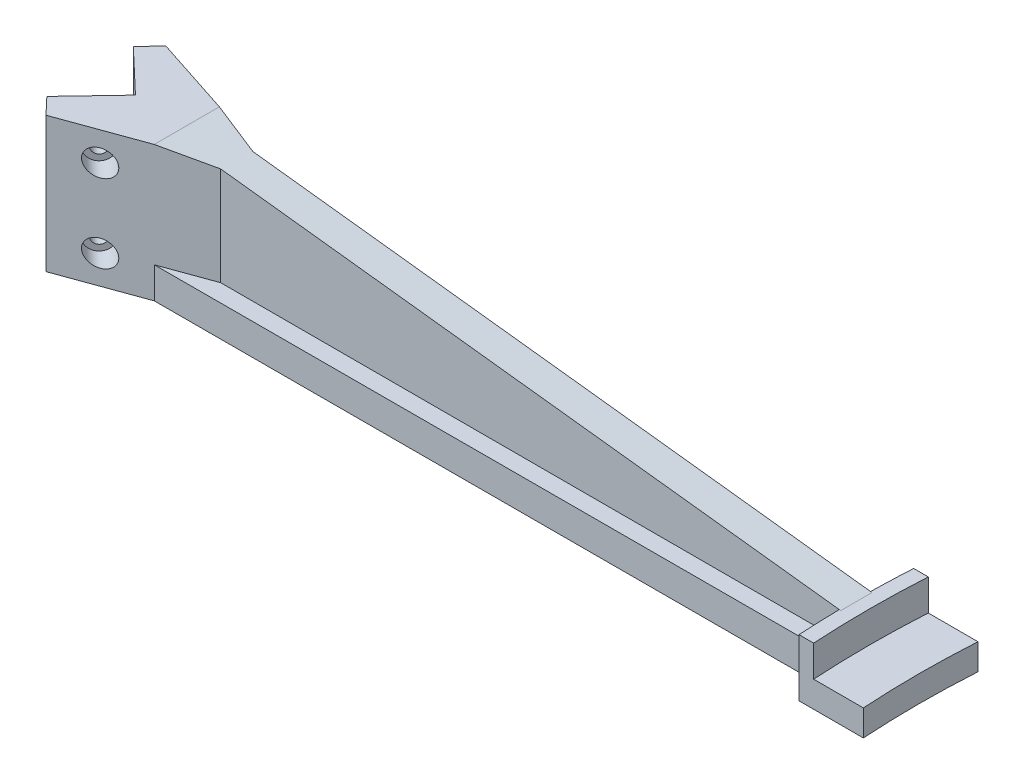
ISO-10303-21;
HEADER;
FILE_DESCRIPTION(('STEP AP214'),'2;1');
FILE_NAME('part.step','',(''),(''),'','','');
FILE_SCHEMA(('AUTOMOTIVE_DESIGN { 1 0 10303 214 1 1 1 1 }'));
ENDSEC;
DATA;
#1=APPLICATION_CONTEXT('core data for automotive mechanical design processes');
#2=APPLICATION_PROTOCOL_DEFINITION('international standard','automotive_design',2000,#1);
#3=PRODUCT_CONTEXT('',#1,'mechanical');
#4=PRODUCT('Part','Part','',(#3));
#5=PRODUCT_RELATED_PRODUCT_CATEGORY('part','',(#4));
#6=PRODUCT_DEFINITION_FORMATION('','',#4);
#7=PRODUCT_DEFINITION_CONTEXT('part definition',#1,'design');
#8=PRODUCT_DEFINITION('design','',#6,#7);
#9=PRODUCT_DEFINITION_SHAPE('','',#8);
#10=(LENGTH_UNIT() NAMED_UNIT(*) SI_UNIT(.MILLI.,.METRE.));
#11=(NAMED_UNIT(*) PLANE_ANGLE_UNIT() SI_UNIT($,.RADIAN.));
#12=(NAMED_UNIT(*) SI_UNIT($,.STERADIAN.) SOLID_ANGLE_UNIT());
#13=UNCERTAINTY_MEASURE_WITH_UNIT(LENGTH_MEASURE(1.E-05),#10,'distance_accuracy_value','');
#14=(GEOMETRIC_REPRESENTATION_CONTEXT(3) GLOBAL_UNCERTAINTY_ASSIGNED_CONTEXT((#13)) GLOBAL_UNIT_ASSIGNED_CONTEXT((#10,
#11,#12)) REPRESENTATION_CONTEXT('',''));
#15=CARTESIAN_POINT('',(0.,0.,0.));
#16=DIRECTION('',(0.,0.,1.));
#17=DIRECTION('',(1.,0.,0.));
#18=AXIS2_PLACEMENT_3D('',#15,#16,#17);
#19=CARTESIAN_POINT('',(-25.6803366585188,-12.,-70.7816506538621));
#20=DIRECTION('',(0.341057417786521,0.,0.940042465941188));
#21=DIRECTION('',(0.940042465941188,0.,-0.341057417786521));
#22=AXIS2_PLACEMENT_3D('',#19,#20,#21);
#23=PLANE('',#22);
#24=CARTESIAN_POINT('',(-271.261664320799,29.,18.3178703823747));
#25=DIRECTION('',(0.341057417786521,0.,0.940042465941188));
#26=DIRECTION('',(-0.940042465941188,0.,0.341057417786521));
#27=AXIS2_PLACEMENT_3D('',#24,#25,#26);
#28=ELLIPSE('',#27,5.58833937893238,4.99999999999999);
#29=CARTESIAN_POINT('',(-276.514940651087,29.,20.2238149806681));
#30=VERTEX_POINT('',#29);
#31=EDGE_CURVE('E191',#30,#30,#28,.T.);
#32=ORIENTED_EDGE('',*,*,#31,.F.);
#33=EDGE_LOOP('',(#32));
#34=FACE_BOUND('',#33,.T.);
#35=CARTESIAN_POINT('',(-271.261664320799,-0.999999999999997,18.3178703823747));
#36=DIRECTION('',(0.341057417786521,0.,0.940042465941188));
#37=DIRECTION('',(-0.940042465941188,0.,0.341057417786521));
#38=AXIS2_PLACEMENT_3D('',#35,#36,#37);
#39=ELLIPSE('',#38,5.58833937893238,4.99999999999999);
#40=CARTESIAN_POINT('',(-276.514940651087,-0.999999999999997,20.2238149806681));
#41=VERTEX_POINT('',#40);
#42=EDGE_CURVE('E322',#41,#41,#39,.T.);
#43=ORIENTED_EDGE('',*,*,#42,.F.);
#44=EDGE_LOOP('',(#43));
#45=FACE_BOUND('',#44,.T.);
#46=DIRECTION('',(0.,1.,0.));
#47=VECTOR('',#46,1.);
#48=CARTESIAN_POINT('',(-237.310427240128,-12.,6.00000000000001));
#49=LINE('',#48,#47);
#50=CARTESIAN_POINT('',(-237.310427240128,0.,6.));
#51=VERTEX_POINT('',#50);
#52=CARTESIAN_POINT('',(-237.310427240129,37.8127309338108,6.));
#53=VERTEX_POINT('',#52);
#54=EDGE_CURVE('E198',#51,#53,#49,.T.);
#55=ORIENTED_EDGE('',*,*,#54,.T.);
#56=DIRECTION('',(-0.934419482049458,0.109212980858722,0.339017339347673));
#57=VECTOR('',#56,1.);
#58=CARTESIAN_POINT('',(-23.1211234088442,12.77873625707,-71.7101604756234));
#59=LINE('',#58,#57);
#60=CARTESIAN_POINT('',(-256.02456554,40.,12.7896886746107));
#61=VERTEX_POINT('',#60);
#62=EDGE_CURVE('E185',#53,#61,#59,.T.);
#63=ORIENTED_EDGE('',*,*,#62,.T.);
#64=DIRECTION('',(0.940042465941188,0.,-0.341057417786521));
#65=VECTOR('',#64,1.);
#66=CARTESIAN_POINT('',(-25.6803366585188,40.,-70.7816506538621));
#67=LINE('',#66,#65);
#68=CARTESIAN_POINT('',(-286.510767905309,40.,23.8504075607723));
#69=VERTEX_POINT('',#68);
#70=EDGE_CURVE('E196',#69,#61,#67,.T.);
#71=ORIENTED_EDGE('',*,*,#70,.F.);
#72=DIRECTION('',(0.,1.,0.));
#73=VECTOR('',#72,1.);
#74=CARTESIAN_POINT('',(-286.510767905309,-12.,23.8504075607723));
#75=LINE('',#74,#73);
#76=CARTESIAN_POINT('',(-286.510767905309,-12.,23.8504075607723));
#77=VERTEX_POINT('',#76);
#78=EDGE_CURVE('E296',#77,#69,#75,.T.);
#79=ORIENTED_EDGE('',*,*,#78,.F.);
#80=DIRECTION('',(0.940042465941188,0.,-0.341057417786521));
#81=VECTOR('',#80,1.);
#82=CARTESIAN_POINT('',(-25.6803366585188,-12.,-70.7816506538621));
#83=LINE('',#82,#81);
#84=CARTESIAN_POINT('',(-256.02456554,-12.,12.7896886746107));
#85=VERTEX_POINT('',#84);
#86=EDGE_CURVE('E285',#77,#85,#83,.T.);
#87=ORIENTED_EDGE('',*,*,#86,.T.);
#88=DIRECTION('',(0.,1.,0.));
#89=VECTOR('',#88,1.);
#90=CARTESIAN_POINT('',(-256.02456554,-12.,12.7896886746107));
#91=LINE('',#90,#89);
#92=CARTESIAN_POINT('',(-256.02456554,0.,12.7896886746107));
#93=VERTEX_POINT('',#92);
#94=EDGE_CURVE('E293',#85,#93,#91,.T.);
#95=ORIENTED_EDGE('',*,*,#94,.T.);
#96=DIRECTION('',(0.940042465941188,0.,-0.341057417786521));
#97=VECTOR('',#96,1.);
#98=CARTESIAN_POINT('',(-25.6803366585188,0.,-70.7816506538621));
#99=LINE('',#98,#97);
#100=EDGE_CURVE('E211',#93,#51,#99,.T.);
#101=ORIENTED_EDGE('',*,*,#100,.T.);
#102=EDGE_LOOP('',(#55,#63,#71,#79,#87,#95,#101));
#103=FACE_BOUND('',#102,.T.);
#104=ADVANCED_FACE('F39',(#34,#45,#103),#23,.T.);
#105=CARTESIAN_POINT('',(-21.000464266402,-12.,64.4135522537525));
#106=DIRECTION('',(-0.309967834756297,0.,0.950747043864188));
#107=DIRECTION('',(0.950747043864188,0.,0.309967834756297));
#108=AXIS2_PLACEMENT_3D('',#105,#106,#107);
#109=PLANE('',#108);
#110=CARTESIAN_POINT('',(-272.154965736293,29.,-17.4692340376555));
#111=DIRECTION('',(-0.309967834756297,0.,0.950747043864188));
#112=DIRECTION('',(-0.950747043864188,0.,-0.309967834756297));
#113=AXIS2_PLACEMENT_3D('',#110,#111,#112);
#114=ELLIPSE('',#113,5.68470562785377,4.99999999999999);
#115=CARTESIAN_POINT('',(-277.559682807213,29.,-19.2313099323483));
#116=VERTEX_POINT('',#115);
#117=EDGE_CURVE('E332',#116,#116,#114,.F.);
#118=ORIENTED_EDGE('',*,*,#117,.F.);
#119=EDGE_LOOP('',(#118));
#120=FACE_BOUND('',#119,.T.);
#121=CARTESIAN_POINT('',(-272.154965736293,-0.999999999999997,-17.4692340376555));
#122=DIRECTION('',(-0.309967834756297,0.,0.950747043864188));
#123=DIRECTION('',(-0.950747043864188,0.,-0.309967834756297));
#124=AXIS2_PLACEMENT_3D('',#121,#122,#123);
#125=ELLIPSE('',#124,5.68470562785377,4.99999999999999);
#126=CARTESIAN_POINT('',(-277.559682807213,-0.999999999999997,-19.2313099323483));
#127=VERTEX_POINT('',#126);
#128=EDGE_CURVE('E337',#127,#127,#125,.F.);
#129=ORIENTED_EDGE('',*,*,#128,.F.);
#130=EDGE_LOOP('',(#129));
#131=FACE_BOUND('',#130,.T.);
#132=DIRECTION('',(-0.944930964694918,0.110441540809588,-0.308071644304268));
#133=VECTOR('',#132,1.);
#134=CARTESIAN_POINT('',(-18.4404308643584,12.2316667715908,65.2481885701696));
#135=LINE('',#134,#133);
#136=CARTESIAN_POINT('',(-236.976024136559,37.7736466034316,-6.));
#137=VERTEX_POINT('',#136);
#138=CARTESIAN_POINT('',(-256.02456554,40.,-12.2103113253893));
#139=VERTEX_POINT('',#138);
#140=EDGE_CURVE('E56',#137,#139,#135,.T.);
#141=ORIENTED_EDGE('',*,*,#140,.F.);
#142=DIRECTION('',(0.,-1.,0.));
#143=VECTOR('',#142,1.);
#144=CARTESIAN_POINT('',(-236.976024136559,-12.,-6.00000000000001));
#145=LINE('',#144,#143);
#146=CARTESIAN_POINT('',(-236.976024136559,0.,-6.));
#147=VERTEX_POINT('',#146);
#148=EDGE_CURVE('E214',#137,#147,#145,.T.);
#149=ORIENTED_EDGE('',*,*,#148,.T.);
#150=DIRECTION('',(0.950747043864188,0.,0.309967834756297));
#151=VECTOR('',#150,1.);
#152=CARTESIAN_POINT('',(-21.000464266402,0.,64.4135522537525));
#153=LINE('',#152,#151);
#154=CARTESIAN_POINT('',(-256.02456554,0.,-12.2103113253893));
#155=VERTEX_POINT('',#154);
#156=EDGE_CURVE('E206',#155,#147,#153,.T.);
#157=ORIENTED_EDGE('',*,*,#156,.F.);
#158=DIRECTION('',(0.,1.,0.));
#159=VECTOR('',#158,1.);
#160=CARTESIAN_POINT('',(-256.02456554,-12.,-12.2103113253893));
#161=LINE('',#160,#159);
#162=CARTESIAN_POINT('',(-256.02456554,-12.,-12.2103113253893));
#163=VERTEX_POINT('',#162);
#164=EDGE_CURVE('E306',#163,#155,#161,.T.);
#165=ORIENTED_EDGE('',*,*,#164,.F.);
#166=DIRECTION('',(0.950747043864188,0.,0.309967834756297));
#167=VECTOR('',#166,1.);
#168=CARTESIAN_POINT('',(-21.000464266402,-12.,64.4135522537525));
#169=LINE('',#168,#167);
#170=CARTESIAN_POINT('',(-286.510767905309,-12.,-22.1495924392277));
#171=VERTEX_POINT('',#170);
#172=EDGE_CURVE('E273',#171,#163,#169,.T.);
#173=ORIENTED_EDGE('',*,*,#172,.F.);
#174=DIRECTION('',(0.,1.,0.));
#175=VECTOR('',#174,1.);
#176=CARTESIAN_POINT('',(-286.510767905309,-12.,-22.1495924392277));
#177=LINE('',#176,#175);
#178=CARTESIAN_POINT('',(-286.510767905309,40.,-22.1495924392277));
#179=VERTEX_POINT('',#178);
#180=EDGE_CURVE('E304',#171,#179,#177,.T.);
#181=ORIENTED_EDGE('',*,*,#180,.T.);
#182=DIRECTION('',(0.950747043864188,0.,0.309967834756297));
#183=VECTOR('',#182,1.);
#184=CARTESIAN_POINT('',(-21.000464266402,40.,64.4135522537525));
#185=LINE('',#184,#183);
#186=EDGE_CURVE('E205',#179,#139,#185,.T.);
#187=ORIENTED_EDGE('',*,*,#186,.T.);
#188=EDGE_LOOP('',(#141,#149,#157,#165,#173,#181,#187));
#189=FACE_BOUND('',#188,.T.);
#190=ADVANCED_FACE('F394',(#120,#131,#189),#109,.F.);
#191=CARTESIAN_POINT('',(0.,40.,0.));
#192=DIRECTION('',(0.,1.,0.));
#193=DIRECTION('',(0.,0.,1.));
#194=AXIS2_PLACEMENT_3D('',#191,#192,#193);
#195=PLANE('',#194);
#196=ORIENTED_EDGE('',*,*,#70,.T.);
#197=DIRECTION('',(0.,0.,1.));
#198=VECTOR('',#197,1.);
#199=CARTESIAN_POINT('',(-256.02456554,40.,-22.1495924392277));
#200=LINE('',#199,#198);
#201=EDGE_CURVE('E181',#139,#61,#200,.T.);
#202=ORIENTED_EDGE('',*,*,#201,.F.);
#203=ORIENTED_EDGE('',*,*,#186,.F.);
#204=DIRECTION('',(0.688749461914691,0.,-0.724999433594415));
#205=VECTOR('',#204,1.);
#206=CARTESIAN_POINT('',(-161.657230340382,40.,-153.574368823362));
#207=LINE('',#206,#205);
#208=CARTESIAN_POINT('',(-292.596610314021,40.,-15.7434425353199));
#209=VERTEX_POINT('',#208);
#210=EDGE_CURVE('E208',#209,#179,#207,.T.);
#211=ORIENTED_EDGE('',*,*,#210,.F.);
#212=DIRECTION('',(-0.724999433594416,0.,-0.688749461914691));
#213=VECTOR('',#212,1.);
#214=CARTESIAN_POINT('',(-130.939379973639,40.,137.830926288042));
#215=LINE('',#214,#213);
#216=CARTESIAN_POINT('',(-276.02456554,40.,0.));
#217=VERTEX_POINT('',#216);
#218=EDGE_CURVE('E219',#217,#209,#215,.T.);
#219=ORIENTED_EDGE('',*,*,#218,.F.);
#220=DIRECTION('',(-0.688749461914691,0.,0.724999433594416));
#221=VECTOR('',#220,1.);
#222=CARTESIAN_POINT('',(-145.085185566361,40.,-137.830926288042));
#223=LINE('',#222,#221);
#224=CARTESIAN_POINT('',(-292.596610314021,40.,17.4442576568645));
#225=VERTEX_POINT('',#224);
#226=EDGE_CURVE('E222',#217,#225,#223,.T.);
#227=ORIENTED_EDGE('',*,*,#226,.T.);
#228=DIRECTION('',(0.688749461914691,0.,0.724999433594415));
#229=VECTOR('',#228,1.);
#230=CARTESIAN_POINT('',(-162.506520414215,40.,154.381194393503));
#231=LINE('',#230,#229);
#232=EDGE_CURVE('E204',#225,#69,#231,.T.);
#233=ORIENTED_EDGE('',*,*,#232,.T.);
#234=EDGE_LOOP('',(#196,#202,#203,#211,#219,#227,#233));
#235=FACE_BOUND('',#234,.T.);
#236=ADVANCED_FACE('F201',(#235),#195,.T.);
#237=CARTESIAN_POINT('',(0.,0.,0.));
#238=DIRECTION('',(0.,1.,0.));
#239=DIRECTION('',(0.,0.,1.));
#240=AXIS2_PLACEMENT_3D('',#237,#238,#239);
#241=PLANE('',#240);
#242=CARTESIAN_POINT('',(370.6,0.,0.));
#243=DIRECTION('',(0.,1.,0.));
#244=DIRECTION('',(0.,0.,1.));
#245=AXIS2_PLACEMENT_3D('',#242,#243,#244);
#246=CIRCLE('',#245,370.6);
#247=CARTESIAN_POINT('',(0.210866790074399,0.,12.5));
#248=VERTEX_POINT('',#247);
#249=CARTESIAN_POINT('',(0.0485730698099318,0.,6.));
#250=VERTEX_POINT('',#249);
#251=EDGE_CURVE('E11',#248,#250,#246,.F.);
#252=ORIENTED_EDGE('',*,*,#251,.T.);
#253=DIRECTION('',(1.,0.,0.));
#254=VECTOR('',#253,1.);
#255=CARTESIAN_POINT('',(-256.02456554,0.,6.));
#256=LINE('',#255,#254);
#257=EDGE_CURVE('E373',#51,#250,#256,.T.);
#258=ORIENTED_EDGE('',*,*,#257,.F.);
#259=ORIENTED_EDGE('',*,*,#100,.F.);
#260=DIRECTION('',(0.999999360921432,0.,-0.00113055593772735));
#261=VECTOR('',#260,1.);
#262=CARTESIAN_POINT('',(0.0141322097109725,0.,12.5002224195901));
#263=LINE('',#262,#261);
#264=EDGE_CURVE('E258',#93,#248,#263,.T.);
#265=ORIENTED_EDGE('',*,*,#264,.T.);
#266=EDGE_LOOP('',(#252,#258,#259,#265));
#267=FACE_BOUND('',#266,.T.);
#268=ADVANCED_FACE('F438',(#267),#241,.T.);
#269=CARTESIAN_POINT('',(370.6,-12.,0.));
#270=DIRECTION('',(0.,1.,0.));
#271=DIRECTION('',(0.,0.,1.));
#272=AXIS2_PLACEMENT_3D('',#269,#270,#271);
#273=CYLINDRICAL_SURFACE('',#272,370.6);
#274=CARTESIAN_POINT('',(370.6,10.,0.));
#275=DIRECTION('',(0.,1.,0.));
#276=DIRECTION('',(0.,0.,1.));
#277=AXIS2_PLACEMENT_3D('',#274,#275,#276);
#278=CIRCLE('',#277,370.6);
#279=CARTESIAN_POINT('',(0.0485730698099318,10.,6.));
#280=VERTEX_POINT('',#279);
#281=CARTESIAN_POINT('',(0.653571445810575,10.,21.9999999999998));
#282=VERTEX_POINT('',#281);
#283=EDGE_CURVE('E235',#280,#282,#278,.T.);
#284=ORIENTED_EDGE('',*,*,#283,.F.);
#285=DIRECTION('',(0.,1.,0.));
#286=VECTOR('',#285,1.);
#287=CARTESIAN_POINT('',(0.0485730698099318,-12.,6.));
#288=LINE('',#287,#286);
#289=EDGE_CURVE('E64',#280,#250,#288,.F.);
#290=ORIENTED_EDGE('',*,*,#289,.T.);
#291=ORIENTED_EDGE('',*,*,#251,.F.);
#292=DIRECTION('',(0.,1.,0.));
#293=VECTOR('',#292,1.);
#294=CARTESIAN_POINT('',(0.210866790074399,-12.,12.5));
#295=LINE('',#294,#293);
#296=CARTESIAN_POINT('',(0.210866790074399,-12.,12.5));
#297=VERTEX_POINT('',#296);
#298=EDGE_CURVE('E288',#297,#248,#295,.T.);
#299=ORIENTED_EDGE('',*,*,#298,.F.);
#300=CARTESIAN_POINT('',(370.6,-12.,0.));
#301=DIRECTION('',(0.,1.,0.));
#302=DIRECTION('',(0.,0.,1.));
#303=AXIS2_PLACEMENT_3D('',#300,#301,#302);
#304=CIRCLE('',#303,370.6);
#305=CARTESIAN_POINT('',(0.653571445810575,-12.,22.));
#306=VERTEX_POINT('',#305);
#307=EDGE_CURVE('E262',#297,#306,#304,.T.);
#308=ORIENTED_EDGE('',*,*,#307,.T.);
#309=DIRECTION('',(0.,1.,0.));
#310=VECTOR('',#309,1.);
#311=CARTESIAN_POINT('',(0.653571445810575,-12.,22.));
#312=LINE('',#311,#310);
#313=EDGE_CURVE('E318',#306,#282,#312,.T.);
#314=ORIENTED_EDGE('',*,*,#313,.T.);
#315=EDGE_LOOP('',(#284,#290,#291,#299,#308,#314));
#316=FACE_BOUND('',#315,.T.);
#317=ADVANCED_FACE('F442',(#316),#273,.T.);
#318=DIRECTION('',(1.,0.,0.));
#319=VECTOR('',#318,1.);
#320=CARTESIAN_POINT('',(-256.02456554,0.,-6.));
#321=LINE('',#320,#319);
#322=CARTESIAN_POINT('',(0.0485730698099318,0.,-6.));
#323=VERTEX_POINT('',#322);
#324=EDGE_CURVE('E377',#147,#323,#321,.T.);
#325=ORIENTED_EDGE('',*,*,#324,.T.);
#326=CARTESIAN_POINT('',(0.210866790074427,0.,-12.5));
#327=VERTEX_POINT('',#326);
#328=EDGE_CURVE('E48',#323,#327,#246,.F.);
#329=ORIENTED_EDGE('',*,*,#328,.T.);
#330=DIRECTION('',(0.999999360921432,0.,-0.00113055593772736));
#331=VECTOR('',#330,1.);
#332=CARTESIAN_POINT('',(-0.0141316706693596,0.,-12.4997456264917));
#333=LINE('',#332,#331);
#334=EDGE_CURVE('E263',#155,#327,#333,.T.);
#335=ORIENTED_EDGE('',*,*,#334,.F.);
#336=ORIENTED_EDGE('',*,*,#156,.T.);
#337=EDGE_LOOP('',(#325,#329,#335,#336));
#338=FACE_BOUND('',#337,.T.);
#339=ADVANCED_FACE('F399',(#338),#241,.T.);
#340=CARTESIAN_POINT('',(0.0141322097109725,-12.,12.5002224195901));
#341=DIRECTION('',(0.00113055593772735,0.,0.999999360921431));
#342=DIRECTION('',(0.999999360921432,0.,-0.00113055593772735));
#343=AXIS2_PLACEMENT_3D('',#340,#341,#342);
#344=PLANE('',#343);
#345=ORIENTED_EDGE('',*,*,#264,.F.);
#346=ORIENTED_EDGE('',*,*,#94,.F.);
#347=DIRECTION('',(0.999999360921432,0.,-0.00113055593772735));
#348=VECTOR('',#347,1.);
#349=CARTESIAN_POINT('',(0.0141322097109725,-12.,12.5002224195901));
#350=LINE('',#349,#348);
#351=EDGE_CURVE('E259',#85,#297,#350,.T.);
#352=ORIENTED_EDGE('',*,*,#351,.T.);
#353=ORIENTED_EDGE('',*,*,#298,.T.);
#354=EDGE_LOOP('',(#345,#346,#352,#353));
#355=FACE_BOUND('',#354,.T.);
#356=ADVANCED_FACE('F41',(#355),#344,.T.);
#357=CARTESIAN_POINT('',(-162.506520414215,-12.,154.381194393503));
#358=DIRECTION('',(-0.724999433594415,0.,0.688749461914691));
#359=DIRECTION('',(0.688749461914691,0.,0.724999433594415));
#360=AXIS2_PLACEMENT_3D('',#357,#358,#359);
#361=PLANE('',#360);
#362=ORIENTED_EDGE('',*,*,#78,.T.);
#363=ORIENTED_EDGE('',*,*,#232,.F.);
#364=DIRECTION('',(0.,1.,0.));
#365=VECTOR('',#364,1.);
#366=CARTESIAN_POINT('',(-292.596610314021,-12.,17.4442576568645));
#367=LINE('',#366,#365);
#368=CARTESIAN_POINT('',(-292.596610314021,-12.,17.4442576568645));
#369=VERTEX_POINT('',#368);
#370=EDGE_CURVE('E298',#369,#225,#367,.T.);
#371=ORIENTED_EDGE('',*,*,#370,.F.);
#372=DIRECTION('',(0.688749461914691,0.,0.724999433594415));
#373=VECTOR('',#372,1.);
#374=CARTESIAN_POINT('',(-162.506520414215,-12.,154.381194393503));
#375=LINE('',#374,#373);
#376=EDGE_CURVE('E282',#369,#77,#375,.T.);
#377=ORIENTED_EDGE('',*,*,#376,.T.);
#378=EDGE_LOOP('',(#362,#363,#371,#377));
#379=FACE_BOUND('',#378,.T.);
#380=ADVANCED_FACE('F428',(#379),#361,.T.);
#381=CARTESIAN_POINT('',(-145.085185566361,-12.,-137.830926288042));
#382=DIRECTION('',(-0.724999433594416,0.,-0.688749461914691));
#383=DIRECTION('',(-0.688749461914691,0.,0.724999433594416));
#384=AXIS2_PLACEMENT_3D('',#381,#382,#383);
#385=PLANE('',#384);
#386=CARTESIAN_POINT('',(-282.912060159147,29.,7.24999433594414));
#387=DIRECTION('',(-0.724999433594416,0.,-0.688749461914691));
#388=DIRECTION('',(-0.688749461914691,0.,0.724999433594416));
#389=AXIS2_PLACEMENT_3D('',#386,#387,#388);
#390=CIRCLE('',#389,2.75000000000005);
#391=CARTESIAN_POINT('',(-284.806121179412,29.,9.24374277832882));
#392=VERTEX_POINT('',#391);
#393=EDGE_CURVE('E331',#392,#392,#390,.T.);
#394=ORIENTED_EDGE('',*,*,#393,.F.);
#395=EDGE_LOOP('',(#394));
#396=FACE_BOUND('',#395,.T.);
#397=CARTESIAN_POINT('',(-282.912060159147,-0.999999999999997,7.24999433594414));
#398=DIRECTION('',(-0.724999433594416,0.,-0.688749461914691));
#399=DIRECTION('',(-0.688749461914691,0.,0.724999433594416));
#400=AXIS2_PLACEMENT_3D('',#397,#398,#399);
#401=CIRCLE('',#400,2.75000000000004);
#402=CARTESIAN_POINT('',(-284.806121179412,-0.999999999999997,9.24374277832882));
#403=VERTEX_POINT('',#402);
#404=EDGE_CURVE('E336',#403,#403,#401,.T.);
#405=ORIENTED_EDGE('',*,*,#404,.F.);
#406=EDGE_LOOP('',(#405));
#407=FACE_BOUND('',#406,.T.);
#408=ORIENTED_EDGE('',*,*,#370,.T.);
#409=ORIENTED_EDGE('',*,*,#226,.F.);
#410=DIRECTION('',(0.,1.,0.));
#411=VECTOR('',#410,1.);
#412=CARTESIAN_POINT('',(-276.02456554,-12.,0.));
#413=LINE('',#412,#411);
#414=CARTESIAN_POINT('',(-276.02456554,-12.,0.));
#415=VERTEX_POINT('',#414);
#416=EDGE_CURVE('E300',#415,#217,#413,.T.);
#417=ORIENTED_EDGE('',*,*,#416,.F.);
#418=DIRECTION('',(-0.688749461914691,0.,0.724999433594416));
#419=VECTOR('',#418,1.);
#420=CARTESIAN_POINT('',(-145.085185566361,-12.,-137.830926288042));
#421=LINE('',#420,#419);
#422=EDGE_CURVE('E279',#415,#369,#421,.T.);
#423=ORIENTED_EDGE('',*,*,#422,.T.);
#424=EDGE_LOOP('',(#408,#409,#417,#423));
#425=FACE_BOUND('',#424,.T.);
#426=ADVANCED_FACE('F491',(#396,#407,#425),#385,.T.);
#427=CARTESIAN_POINT('',(-130.939379973639,-12.,137.830926288042));
#428=DIRECTION('',(0.688749461914691,0.,-0.724999433594416));
#429=DIRECTION('',(-0.724999433594416,0.,-0.688749461914691));
#430=AXIS2_PLACEMENT_3D('',#427,#428,#429);
#431=PLANE('',#430);
#432=CARTESIAN_POINT('',(-283.284099342176,29.,-6.89655711206674));
#433=DIRECTION('',(0.688749461914691,0.,-0.724999433594416));
#434=DIRECTION('',(-0.724999433594416,0.,-0.688749461914691));
#435=AXIS2_PLACEMENT_3D('',#432,#433,#434);
#436=ELLIPSE('',#435,2.75361842105268,2.75000000000005);
#437=CARTESIAN_POINT('',(-285.280471137774,29.,-8.79311031788516));
#438=VERTEX_POINT('',#437);
#439=EDGE_CURVE('E344',#438,#438,#436,.F.);
#440=ORIENTED_EDGE('',*,*,#439,.F.);
#441=EDGE_LOOP('',(#440));
#442=FACE_BOUND('',#441,.T.);
#443=CARTESIAN_POINT('',(-283.284099342176,-0.999999999999997,-6.89655711206674));
#444=DIRECTION('',(0.688749461914691,0.,-0.724999433594416));
#445=DIRECTION('',(-0.724999433594416,0.,-0.688749461914691));
#446=AXIS2_PLACEMENT_3D('',#443,#444,#445);
#447=ELLIPSE('',#446,2.75361842105268,2.75000000000004);
#448=CARTESIAN_POINT('',(-285.280471137774,-0.999999999999997,-8.79311031788516));
#449=VERTEX_POINT('',#448);
#450=EDGE_CURVE('E352',#449,#449,#447,.F.);
#451=ORIENTED_EDGE('',*,*,#450,.F.);
#452=EDGE_LOOP('',(#451));
#453=FACE_BOUND('',#452,.T.);
#454=ORIENTED_EDGE('',*,*,#416,.T.);
#455=ORIENTED_EDGE('',*,*,#218,.T.);
#456=DIRECTION('',(0.,1.,0.));
#457=VECTOR('',#456,1.);
#458=CARTESIAN_POINT('',(-292.596610314021,-12.,-15.7434425353199));
#459=LINE('',#458,#457);
#460=CARTESIAN_POINT('',(-292.596610314021,-12.,-15.7434425353199));
#461=VERTEX_POINT('',#460);
#462=EDGE_CURVE('E302',#461,#209,#459,.T.);
#463=ORIENTED_EDGE('',*,*,#462,.F.);
#464=DIRECTION('',(-0.724999433594416,0.,-0.688749461914691));
#465=VECTOR('',#464,1.);
#466=CARTESIAN_POINT('',(-130.939379973639,-12.,137.830926288042));
#467=LINE('',#466,#465);
#468=EDGE_CURVE('E277',#415,#461,#467,.T.);
#469=ORIENTED_EDGE('',*,*,#468,.F.);
#470=EDGE_LOOP('',(#454,#455,#463,#469));
#471=FACE_BOUND('',#470,.T.);
#472=ADVANCED_FACE('F423',(#442,#453,#471),#431,.F.);
#473=CARTESIAN_POINT('',(-161.657230340382,-12.,-153.574368823362));
#474=DIRECTION('',(0.724999433594415,0.,0.688749461914691));
#475=DIRECTION('',(0.688749461914691,0.,-0.724999433594415));
#476=AXIS2_PLACEMENT_3D('',#473,#474,#475);
#477=PLANE('',#476);
#478=ORIENTED_EDGE('',*,*,#462,.T.);
#479=ORIENTED_EDGE('',*,*,#210,.T.);
#480=ORIENTED_EDGE('',*,*,#180,.F.);
#481=DIRECTION('',(0.688749461914691,0.,-0.724999433594415));
#482=VECTOR('',#481,1.);
#483=CARTESIAN_POINT('',(-161.657230340382,-12.,-153.574368823362));
#484=LINE('',#483,#482);
#485=EDGE_CURVE('E275',#461,#171,#484,.T.);
#486=ORIENTED_EDGE('',*,*,#485,.F.);
#487=EDGE_LOOP('',(#478,#479,#480,#486));
#488=FACE_BOUND('',#487,.T.);
#489=ADVANCED_FACE('F419',(#488),#477,.F.);
#490=CARTESIAN_POINT('',(-0.0141316706693596,-12.,-12.4997456264917));
#491=DIRECTION('',(0.00113055593772736,0.,0.999999360921431));
#492=DIRECTION('',(0.999999360921432,0.,-0.00113055593772736));
#493=AXIS2_PLACEMENT_3D('',#490,#491,#492);
#494=PLANE('',#493);
#495=ORIENTED_EDGE('',*,*,#334,.T.);
#496=DIRECTION('',(0.,1.,0.));
#497=VECTOR('',#496,1.);
#498=CARTESIAN_POINT('',(0.210866790074399,-12.,-12.5));
#499=LINE('',#498,#497);
#500=CARTESIAN_POINT('',(0.210866790074399,-12.,-12.5));
#501=VERTEX_POINT('',#500);
#502=EDGE_CURVE('E309',#501,#327,#499,.T.);
#503=ORIENTED_EDGE('',*,*,#502,.F.);
#504=DIRECTION('',(0.999999360921432,0.,-0.00113055593772736));
#505=VECTOR('',#504,1.);
#506=CARTESIAN_POINT('',(-0.0141316706693596,-12.,-12.4997456264917));
#507=LINE('',#506,#505);
#508=EDGE_CURVE('E271',#163,#501,#507,.T.);
#509=ORIENTED_EDGE('',*,*,#508,.F.);
#510=ORIENTED_EDGE('',*,*,#164,.T.);
#511=EDGE_LOOP('',(#495,#503,#509,#510));
#512=FACE_BOUND('',#511,.T.);
#513=ADVANCED_FACE('F403',(#512),#494,.F.);
#514=DIRECTION('',(0.,1.,0.));
#515=VECTOR('',#514,1.);
#516=CARTESIAN_POINT('',(0.0485730698099318,-12.,-6.));
#517=LINE('',#516,#515);
#518=CARTESIAN_POINT('',(0.0485730698099318,10.,-6.));
#519=VERTEX_POINT('',#518);
#520=EDGE_CURVE('E388',#519,#323,#517,.F.);
#521=ORIENTED_EDGE('',*,*,#520,.F.);
#522=CARTESIAN_POINT('',(0.653571445810575,10.,-22.));
#523=VERTEX_POINT('',#522);
#524=EDGE_CURVE('E236',#523,#519,#278,.T.);
#525=ORIENTED_EDGE('',*,*,#524,.F.);
#526=DIRECTION('',(0.,1.,0.));
#527=VECTOR('',#526,1.);
#528=CARTESIAN_POINT('',(0.653571445810575,-12.,-22.));
#529=LINE('',#528,#527);
#530=CARTESIAN_POINT('',(0.653571445810575,-12.,-22.));
#531=VERTEX_POINT('',#530);
#532=EDGE_CURVE('E312',#531,#523,#529,.T.);
#533=ORIENTED_EDGE('',*,*,#532,.F.);
#534=EDGE_CURVE('E267',#531,#501,#304,.T.);
#535=ORIENTED_EDGE('',*,*,#534,.T.);
#536=ORIENTED_EDGE('',*,*,#502,.T.);
#537=ORIENTED_EDGE('',*,*,#328,.F.);
#538=EDGE_LOOP('',(#521,#525,#533,#535,#536,#537));
#539=FACE_BOUND('',#538,.T.);
#540=ADVANCED_FACE('F407',(#539),#273,.T.);
#541=CARTESIAN_POINT('',(0.,-12.,-22.));
#542=DIRECTION('',(0.,0.,1.));
#543=DIRECTION('',(1.,0.,0.));
#544=AXIS2_PLACEMENT_3D('',#541,#542,#543);
#545=PLANE('',#544);
#546=DIRECTION('',(0.,-1.,0.));
#547=VECTOR('',#546,1.);
#548=CARTESIAN_POINT('',(25.3402114349254,-2.,-22.));
#549=LINE('',#548,#547);
#550=CARTESIAN_POINT('',(25.3402114349254,-2.,-22.));
#551=VERTEX_POINT('',#550);
#552=CARTESIAN_POINT('',(25.3402114349254,-12.,-22.));
#553=VERTEX_POINT('',#552);
#554=EDGE_CURVE('E250',#551,#553,#549,.T.);
#555=ORIENTED_EDGE('',*,*,#554,.T.);
#556=DIRECTION('',(1.,0.,0.));
#557=VECTOR('',#556,1.);
#558=CARTESIAN_POINT('',(0.,-12.,-22.));
#559=LINE('',#558,#557);
#560=EDGE_CURVE('E269',#531,#553,#559,.T.);
#561=ORIENTED_EDGE('',*,*,#560,.F.);
#562=ORIENTED_EDGE('',*,*,#532,.T.);
#563=DIRECTION('',(1.,0.,0.));
#564=VECTOR('',#563,1.);
#565=CARTESIAN_POINT('',(0.,10.,-22.));
#566=LINE('',#565,#564);
#567=CARTESIAN_POINT('',(6.26361696915306,10.,-22.));
#568=VERTEX_POINT('',#567);
#569=EDGE_CURVE('E232',#523,#568,#566,.T.);
#570=ORIENTED_EDGE('',*,*,#569,.T.);
#571=DIRECTION('',(0.,1.,0.));
#572=VECTOR('',#571,1.);
#573=CARTESIAN_POINT('',(6.26361696915312,-12.,-22.));
#574=LINE('',#573,#572);
#575=CARTESIAN_POINT('',(6.26361696915306,-2.,-22.));
#576=VERTEX_POINT('',#575);
#577=EDGE_CURVE('E314',#576,#568,#574,.T.);
#578=ORIENTED_EDGE('',*,*,#577,.F.);
#579=DIRECTION('',(1.,0.,0.));
#580=VECTOR('',#579,1.);
#581=CARTESIAN_POINT('',(0.,-2.,-22.));
#582=LINE('',#581,#580);
#583=EDGE_CURVE('E245',#576,#551,#582,.T.);
#584=ORIENTED_EDGE('',*,*,#583,.T.);
#585=EDGE_LOOP('',(#555,#561,#562,#570,#578,#584));
#586=FACE_BOUND('',#585,.T.);
#587=ADVANCED_FACE('F453',(#586),#545,.F.);
#588=CARTESIAN_POINT('',(370.6,-12.,0.));
#589=DIRECTION('',(0.,1.,0.));
#590=DIRECTION('',(0.,0.,1.));
#591=AXIS2_PLACEMENT_3D('',#588,#589,#590);
#592=CYLINDRICAL_SURFACE('',#591,365.);
#593=DIRECTION('',(0.,1.,0.));
#594=VECTOR('',#593,1.);
#595=CARTESIAN_POINT('',(6.26361696915312,-12.,22.));
#596=LINE('',#595,#594);
#597=CARTESIAN_POINT('',(6.26361696915306,-2.,21.9999999999999));
#598=VERTEX_POINT('',#597);
#599=CARTESIAN_POINT('',(6.26361696915306,10.,21.9999999999999));
#600=VERTEX_POINT('',#599);
#601=EDGE_CURVE('E316',#598,#600,#596,.T.);
#602=ORIENTED_EDGE('',*,*,#601,.F.);
#603=CARTESIAN_POINT('',(370.6,-2.,0.));
#604=DIRECTION('',(0.,1.,0.));
#605=DIRECTION('',(0.,0.,1.));
#606=AXIS2_PLACEMENT_3D('',#603,#604,#605);
#607=CIRCLE('',#606,365.);
#608=EDGE_CURVE('E248',#576,#598,#607,.T.);
#609=ORIENTED_EDGE('',*,*,#608,.F.);
#610=ORIENTED_EDGE('',*,*,#577,.T.);
#611=CARTESIAN_POINT('',(370.6,10.,0.));
#612=DIRECTION('',(0.,1.,0.));
#613=DIRECTION('',(0.,0.,1.));
#614=AXIS2_PLACEMENT_3D('',#611,#612,#613);
#615=CIRCLE('',#614,365.);
#616=EDGE_CURVE('E229',#568,#600,#615,.T.);
#617=ORIENTED_EDGE('',*,*,#616,.T.);
#618=EDGE_LOOP('',(#602,#609,#610,#617));
#619=FACE_BOUND('',#618,.T.);
#620=ADVANCED_FACE('F465',(#619),#592,.F.);
#621=CARTESIAN_POINT('',(0.,-12.,22.));
#622=DIRECTION('',(0.,0.,1.));
#623=DIRECTION('',(1.,0.,0.));
#624=AXIS2_PLACEMENT_3D('',#621,#622,#623);
#625=PLANE('',#624);
#626=DIRECTION('',(1.,0.,0.));
#627=VECTOR('',#626,1.);
#628=CARTESIAN_POINT('',(0.,-2.,22.));
#629=LINE('',#628,#627);
#630=CARTESIAN_POINT('',(25.3402114349254,-2.,21.9999999999998));
#631=VERTEX_POINT('',#630);
#632=EDGE_CURVE('E240',#598,#631,#629,.T.);
#633=ORIENTED_EDGE('',*,*,#632,.F.);
#634=ORIENTED_EDGE('',*,*,#601,.T.);
#635=DIRECTION('',(1.,0.,0.));
#636=VECTOR('',#635,1.);
#637=CARTESIAN_POINT('',(0.,10.,22.));
#638=LINE('',#637,#636);
#639=EDGE_CURVE('E225',#282,#600,#638,.T.);
#640=ORIENTED_EDGE('',*,*,#639,.F.);
#641=ORIENTED_EDGE('',*,*,#313,.F.);
#642=DIRECTION('',(1.,0.,0.));
#643=VECTOR('',#642,1.);
#644=CARTESIAN_POINT('',(0.,-12.,22.));
#645=LINE('',#644,#643);
#646=CARTESIAN_POINT('',(25.3402114349254,-12.,21.9999999999998));
#647=VERTEX_POINT('',#646);
#648=EDGE_CURVE('E266',#306,#647,#645,.T.);
#649=ORIENTED_EDGE('',*,*,#648,.T.);
#650=DIRECTION('',(0.,-1.,0.));
#651=VECTOR('',#650,1.);
#652=CARTESIAN_POINT('',(25.3402114349254,-2.,21.9999999999998));
#653=LINE('',#652,#651);
#654=EDGE_CURVE('E255',#631,#647,#653,.T.);
#655=ORIENTED_EDGE('',*,*,#654,.F.);
#656=EDGE_LOOP('',(#633,#634,#640,#641,#649,#655));
#657=FACE_BOUND('',#656,.T.);
#658=ADVANCED_FACE('F461',(#657),#625,.T.);
#659=CARTESIAN_POINT('',(0.,-12.,0.));
#660=DIRECTION('',(0.,1.,0.));
#661=DIRECTION('',(0.,0.,1.));
#662=AXIS2_PLACEMENT_3D('',#659,#660,#661);
#663=PLANE('',#662);
#664=CARTESIAN_POINT('',(370.6,-12.,0.));
#665=DIRECTION('',(0.,1.,0.));
#666=DIRECTION('',(0.,0.,1.));
#667=AXIS2_PLACEMENT_3D('',#664,#665,#666);
#668=CIRCLE('',#667,345.96);
#669=EDGE_CURVE('E239',#553,#647,#668,.T.);
#670=ORIENTED_EDGE('',*,*,#669,.T.);
#671=ORIENTED_EDGE('',*,*,#648,.F.);
#672=ORIENTED_EDGE('',*,*,#307,.F.);
#673=ORIENTED_EDGE('',*,*,#351,.F.);
#674=ORIENTED_EDGE('',*,*,#86,.F.);
#675=ORIENTED_EDGE('',*,*,#376,.F.);
#676=ORIENTED_EDGE('',*,*,#422,.F.);
#677=ORIENTED_EDGE('',*,*,#468,.T.);
#678=ORIENTED_EDGE('',*,*,#485,.T.);
#679=ORIENTED_EDGE('',*,*,#172,.T.);
#680=ORIENTED_EDGE('',*,*,#508,.T.);
#681=ORIENTED_EDGE('',*,*,#534,.F.);
#682=ORIENTED_EDGE('',*,*,#560,.T.);
#683=EDGE_LOOP('',(#670,#671,#672,#673,#674,#675,#676,#677,#678,#679,#680,#681,#682));
#684=FACE_BOUND('',#683,.T.);
#685=ADVANCED_FACE('F412',(#684),#663,.F.);
#686=CARTESIAN_POINT('',(370.6,-2.,0.));
#687=DIRECTION('',(0.,-1.,0.));
#688=DIRECTION('',(0.,0.,-1.));
#689=AXIS2_PLACEMENT_3D('',#686,#687,#688);
#690=CYLINDRICAL_SURFACE('',#689,345.96);
#691=ORIENTED_EDGE('',*,*,#669,.F.);
#692=ORIENTED_EDGE('',*,*,#554,.F.);
#693=CARTESIAN_POINT('',(370.6,-2.,0.));
#694=DIRECTION('',(0.,1.,0.));
#695=DIRECTION('',(0.,0.,1.));
#696=AXIS2_PLACEMENT_3D('',#693,#694,#695);
#697=CIRCLE('',#696,345.96);
#698=EDGE_CURVE('E242',#551,#631,#697,.T.);
#699=ORIENTED_EDGE('',*,*,#698,.T.);
#700=ORIENTED_EDGE('',*,*,#654,.T.);
#701=EDGE_LOOP('',(#691,#692,#699,#700));
#702=FACE_BOUND('',#701,.T.);
#703=ADVANCED_FACE('F457',(#702),#690,.F.);
#704=CARTESIAN_POINT('',(370.6,-2.,0.));
#705=DIRECTION('',(0.,1.,0.));
#706=DIRECTION('',(0.,0.,1.));
#707=AXIS2_PLACEMENT_3D('',#704,#705,#706);
#708=PLANE('',#707);
#709=ORIENTED_EDGE('',*,*,#632,.T.);
#710=ORIENTED_EDGE('',*,*,#698,.F.);
#711=ORIENTED_EDGE('',*,*,#583,.F.);
#712=ORIENTED_EDGE('',*,*,#608,.T.);
#713=EDGE_LOOP('',(#709,#710,#711,#712));
#714=FACE_BOUND('',#713,.T.);
#715=ADVANCED_FACE('F467',(#714),#708,.T.);
#716=CARTESIAN_POINT('',(370.6,10.,0.));
#717=DIRECTION('',(0.,1.,0.));
#718=DIRECTION('',(0.,0.,1.));
#719=AXIS2_PLACEMENT_3D('',#716,#717,#718);
#720=PLANE('',#719);
#721=DIRECTION('',(0.,0.,1.));
#722=VECTOR('',#721,1.);
#723=CARTESIAN_POINT('',(0.653571445810575,10.,-6.));
#724=LINE('',#723,#722);
#725=CARTESIAN_POINT('',(0.653571445810575,10.,-6.));
#726=VERTEX_POINT('',#725);
#727=CARTESIAN_POINT('',(0.653571445810575,10.,6.));
#728=VERTEX_POINT('',#727);
#729=EDGE_CURVE('E380',#726,#728,#724,.T.);
#730=ORIENTED_EDGE('',*,*,#729,.T.);
#731=DIRECTION('',(-1.,0.,0.));
#732=VECTOR('',#731,1.);
#733=CARTESIAN_POINT('',(370.6,10.,6.));
#734=LINE('',#733,#732);
#735=EDGE_CURVE('E383',#728,#280,#734,.T.);
#736=ORIENTED_EDGE('',*,*,#735,.T.);
#737=ORIENTED_EDGE('',*,*,#283,.T.);
#738=ORIENTED_EDGE('',*,*,#639,.T.);
#739=ORIENTED_EDGE('',*,*,#616,.F.);
#740=ORIENTED_EDGE('',*,*,#569,.F.);
#741=ORIENTED_EDGE('',*,*,#524,.T.);
#742=DIRECTION('',(-1.,0.,0.));
#743=VECTOR('',#742,1.);
#744=CARTESIAN_POINT('',(370.6,10.,-6.));
#745=LINE('',#744,#743);
#746=EDGE_CURVE('E387',#726,#519,#745,.T.);
#747=ORIENTED_EDGE('',*,*,#746,.F.);
#748=EDGE_LOOP('',(#730,#736,#737,#738,#739,#740,#741,#747));
#749=FACE_BOUND('',#748,.T.);
#750=ADVANCED_FACE('F445',(#749),#720,.T.);
#751=CARTESIAN_POINT('',(0.,0.,-6.));
#752=DIRECTION('',(0.,0.,-1.));
#753=DIRECTION('',(-1.,0.,0.));
#754=AXIS2_PLACEMENT_3D('',#751,#752,#753);
#755=PLANE('',#754);
#756=ORIENTED_EDGE('',*,*,#148,.F.);
#757=DIRECTION('',(-0.993238969664045,0.116087678677396,0.));
#758=VECTOR('',#757,1.);
#759=CARTESIAN_POINT('',(0.653571445810575,10.,-6.));
#760=LINE('',#759,#758);
#761=EDGE_CURVE('E375',#726,#137,#760,.T.);
#762=ORIENTED_EDGE('',*,*,#761,.F.);
#763=ORIENTED_EDGE('',*,*,#746,.T.);
#764=ORIENTED_EDGE('',*,*,#520,.T.);
#765=ORIENTED_EDGE('',*,*,#324,.F.);
#766=EDGE_LOOP('',(#756,#762,#763,#764,#765));
#767=FACE_BOUND('',#766,.T.);
#768=ADVANCED_FACE('F449',(#767),#755,.T.);
#769=CARTESIAN_POINT('',(0.653571445810575,10.,-6.));
#770=DIRECTION('',(0.116087678677396,0.993238969664045,0.));
#771=DIRECTION('',(-0.993238969664045,0.116087678677396,0.));
#772=AXIS2_PLACEMENT_3D('',#769,#770,#771);
#773=PLANE('',#772);
#774=ORIENTED_EDGE('',*,*,#62,.F.);
#775=DIRECTION('',(-0.993238969664045,0.116087678677396,0.));
#776=VECTOR('',#775,1.);
#777=CARTESIAN_POINT('',(0.653571445810575,10.,6.));
#778=LINE('',#777,#776);
#779=EDGE_CURVE('E371',#728,#53,#778,.T.);
#780=ORIENTED_EDGE('',*,*,#779,.F.);
#781=ORIENTED_EDGE('',*,*,#729,.F.);
#782=ORIENTED_EDGE('',*,*,#761,.T.);
#783=ORIENTED_EDGE('',*,*,#140,.T.);
#784=ORIENTED_EDGE('',*,*,#201,.T.);
#785=EDGE_LOOP('',(#774,#780,#781,#782,#783,#784));
#786=FACE_BOUND('',#785,.T.);
#787=ADVANCED_FACE('F183',(#786),#773,.T.);
#788=CARTESIAN_POINT('',(0.,0.,6.));
#789=DIRECTION('',(0.,0.,-1.));
#790=DIRECTION('',(-1.,0.,0.));
#791=AXIS2_PLACEMENT_3D('',#788,#789,#790);
#792=PLANE('',#791);
#793=ORIENTED_EDGE('',*,*,#54,.F.);
#794=ORIENTED_EDGE('',*,*,#257,.T.);
#795=ORIENTED_EDGE('',*,*,#289,.F.);
#796=ORIENTED_EDGE('',*,*,#735,.F.);
#797=ORIENTED_EDGE('',*,*,#779,.T.);
#798=EDGE_LOOP('',(#793,#794,#795,#796,#797));
#799=FACE_BOUND('',#798,.T.);
#800=ADVANCED_FACE('F448',(#799),#792,.F.);
#801=CARTESIAN_POINT('',(-112.597913427131,-0.999999999999997,169.048433731359));
#802=DIRECTION('',(-0.724999433594416,0.,-0.688749461914691));
#803=DIRECTION('',(-0.688749461914691,0.,0.724999433594416));
#804=AXIS2_PLACEMENT_3D('',#801,#802,#803);
#805=CYLINDRICAL_SURFACE('',#804,4.99999999999999);
#806=ORIENTED_EDGE('',*,*,#42,.T.);
#807=EDGE_LOOP('',(#806));
#808=FACE_BOUND('',#807,.T.);
#809=CARTESIAN_POINT('',(-277.112064690391,-0.999999999999997,12.7599900312617));
#810=DIRECTION('',(-0.724999433594416,0.,-0.688749461914691));
#811=DIRECTION('',(-0.688749461914691,0.,0.724999433594416));
#812=AXIS2_PLACEMENT_3D('',#809,#810,#811);
#813=CIRCLE('',#812,4.99999999999999);
#814=CARTESIAN_POINT('',(-280.555811999965,-0.999999999999997,16.3849871992338));
#815=VERTEX_POINT('',#814);
#816=EDGE_CURVE('E365',#815,#815,#813,.T.);
#817=ORIENTED_EDGE('',*,*,#816,.T.);
#818=EDGE_LOOP('',(#817));
#819=FACE_BOUND('',#818,.T.);
#820=ADVANCED_FACE('F691',(#808,#819),#805,.F.);
#821=CARTESIAN_POINT('',(-277.112064690391,-0.999999999999997,12.7599900312617));
#822=DIRECTION('',(-0.724999433594416,0.,-0.688749461914691));
#823=DIRECTION('',(-0.688749461914691,0.,0.724999433594416));
#824=AXIS2_PLACEMENT_3D('',#821,#822,#823);
#825=PLANE('',#824);
#826=CARTESIAN_POINT('',(-277.112064690391,-0.999999999999997,12.7599900312617));
#827=DIRECTION('',(-0.724999433594416,0.,-0.688749461914691));
#828=DIRECTION('',(-0.688749461914691,0.,0.724999433594416));
#829=AXIS2_PLACEMENT_3D('',#826,#827,#828);
#830=CIRCLE('',#829,2.75000000000004);
#831=CARTESIAN_POINT('',(-279.006125710657,-0.999999999999997,14.7537384736464));
#832=VERTEX_POINT('',#831);
#833=EDGE_CURVE('E333',#832,#832,#830,.T.);
#834=ORIENTED_EDGE('',*,*,#833,.T.);
#835=EDGE_LOOP('',(#834));
#836=FACE_BOUND('',#835,.T.);
#837=ORIENTED_EDGE('',*,*,#816,.F.);
#838=EDGE_LOOP('',(#837));
#839=FACE_BOUND('',#838,.T.);
#840=ADVANCED_FACE('F740',(#836,#839),#825,.F.);
#841=CARTESIAN_POINT('',(-112.597913427131,29.,169.048433731359));
#842=DIRECTION('',(-0.724999433594416,0.,-0.688749461914691));
#843=DIRECTION('',(-0.688749461914691,0.,0.724999433594416));
#844=AXIS2_PLACEMENT_3D('',#841,#842,#843);
#845=CYLINDRICAL_SURFACE('',#844,4.99999999999999);
#846=ORIENTED_EDGE('',*,*,#31,.T.);
#847=EDGE_LOOP('',(#846));
#848=FACE_BOUND('',#847,.T.);
#849=CARTESIAN_POINT('',(-277.112064690391,29.,12.7599900312617));
#850=DIRECTION('',(-0.724999433594416,0.,-0.688749461914691));
#851=DIRECTION('',(-0.688749461914691,0.,0.724999433594416));
#852=AXIS2_PLACEMENT_3D('',#849,#850,#851);
#853=CIRCLE('',#852,4.99999999999999);
#854=CARTESIAN_POINT('',(-280.555811999965,29.,16.3849871992338));
#855=VERTEX_POINT('',#854);
#856=EDGE_CURVE('E325',#855,#855,#853,.T.);
#857=ORIENTED_EDGE('',*,*,#856,.T.);
#858=EDGE_LOOP('',(#857));
#859=FACE_BOUND('',#858,.T.);
#860=ADVANCED_FACE('F749',(#848,#859),#845,.F.);
#861=CARTESIAN_POINT('',(-277.112064690391,29.,12.7599900312617));
#862=DIRECTION('',(-0.724999433594416,0.,-0.688749461914691));
#863=DIRECTION('',(-0.688749461914691,0.,0.724999433594416));
#864=AXIS2_PLACEMENT_3D('',#861,#862,#863);
#865=PLANE('',#864);
#866=CARTESIAN_POINT('',(-277.112064690391,29.,12.7599900312617));
#867=DIRECTION('',(-0.724999433594416,0.,-0.688749461914691));
#868=DIRECTION('',(-0.688749461914691,0.,0.724999433594416));
#869=AXIS2_PLACEMENT_3D('',#866,#867,#868);
#870=CIRCLE('',#869,2.75000000000005);
#871=CARTESIAN_POINT('',(-279.006125710657,29.,14.7537384736464));
#872=VERTEX_POINT('',#871);
#873=EDGE_CURVE('E328',#872,#872,#870,.T.);
#874=ORIENTED_EDGE('',*,*,#873,.T.);
#875=EDGE_LOOP('',(#874));
#876=FACE_BOUND('',#875,.T.);
#877=ORIENTED_EDGE('',*,*,#856,.F.);
#878=EDGE_LOOP('',(#877));
#879=FACE_BOUND('',#878,.T.);
#880=ADVANCED_FACE('F758',(#876,#879),#865,.F.);
#881=CARTESIAN_POINT('',(-112.597913427131,29.,169.048433731359));
#882=DIRECTION('',(-0.724999433594416,0.,-0.688749461914691));
#883=DIRECTION('',(-0.688749461914691,0.,0.724999433594416));
#884=AXIS2_PLACEMENT_3D('',#881,#882,#883);
#885=CYLINDRICAL_SURFACE('',#884,2.75000000000005);
#886=ORIENTED_EDGE('',*,*,#393,.T.);
#887=EDGE_LOOP('',(#886));
#888=FACE_BOUND('',#887,.T.);
#889=ORIENTED_EDGE('',*,*,#873,.F.);
#890=EDGE_LOOP('',(#889));
#891=FACE_BOUND('',#890,.T.);
#892=ADVANCED_FACE('F767',(#888,#891),#885,.F.);
#893=CARTESIAN_POINT('',(-112.597913427131,-0.999999999999997,169.048433731359));
#894=DIRECTION('',(-0.724999433594416,0.,-0.688749461914691));
#895=DIRECTION('',(-0.688749461914691,0.,0.724999433594416));
#896=AXIS2_PLACEMENT_3D('',#893,#894,#895);
#897=CYLINDRICAL_SURFACE('',#896,2.75000000000004);
#898=ORIENTED_EDGE('',*,*,#404,.T.);
#899=EDGE_LOOP('',(#898));
#900=FACE_BOUND('',#899,.T.);
#901=ORIENTED_EDGE('',*,*,#833,.F.);
#902=EDGE_LOOP('',(#901));
#903=FACE_BOUND('',#902,.T.);
#904=ADVANCED_FACE('F777',(#900,#903),#897,.F.);
#905=CARTESIAN_POINT('',(-113.447203500964,-0.999999999999997,-168.241608161217));
#906=DIRECTION('',(-0.724999433594416,0.,0.688749461914691));
#907=DIRECTION('',(0.688749461914691,0.,0.724999433594416));
#908=AXIS2_PLACEMENT_3D('',#905,#906,#907);
#909=CYLINDRICAL_SURFACE('',#908,4.99999999999999);
#910=CARTESIAN_POINT('',(-277.112064690391,-0.999999999999997,-12.7599900312617));
#911=DIRECTION('',(0.724999433594416,0.,-0.688749461914691));
#912=DIRECTION('',(-0.688749461914691,0.,-0.724999433594416));
#913=AXIS2_PLACEMENT_3D('',#910,#911,#912);
#914=CIRCLE('',#913,4.99999999999999);
#915=CARTESIAN_POINT('',(-280.555811999965,-0.999999999999997,-16.3849871992338));
#916=VERTEX_POINT('',#915);
#917=EDGE_CURVE('E356',#916,#916,#914,.T.);
#918=ORIENTED_EDGE('',*,*,#917,.F.);
#919=EDGE_LOOP('',(#918));
#920=FACE_BOUND('',#919,.T.);
#921=ORIENTED_EDGE('',*,*,#128,.T.);
#922=EDGE_LOOP('',(#921));
#923=FACE_BOUND('',#922,.T.);
#924=ADVANCED_FACE('F787',(#920,#923),#909,.F.);
#925=CARTESIAN_POINT('',(-277.112064690391,-0.999999999999997,-12.7599900312617));
#926=DIRECTION('',(-0.724999433594416,0.,0.688749461914691));
#927=DIRECTION('',(-0.688749461914691,0.,-0.724999433594416));
#928=AXIS2_PLACEMENT_3D('',#925,#926,#927);
#929=PLANE('',#928);
#930=CARTESIAN_POINT('',(-277.112064690391,-0.999999999999997,-12.7599900312617));
#931=DIRECTION('',(-0.724999433594416,0.,0.688749461914691));
#932=DIRECTION('',(0.688749461914691,0.,0.724999433594416));
#933=AXIS2_PLACEMENT_3D('',#930,#931,#932);
#934=CIRCLE('',#933,2.75000000000004);
#935=CARTESIAN_POINT('',(-275.218003670126,-0.999999999999997,-10.766241588877));
#936=VERTEX_POINT('',#935);
#937=EDGE_CURVE('E43',#936,#936,#934,.F.);
#938=ORIENTED_EDGE('',*,*,#937,.F.);
#939=EDGE_LOOP('',(#938));
#940=FACE_BOUND('',#939,.T.);
#941=ORIENTED_EDGE('',*,*,#917,.T.);
#942=EDGE_LOOP('',(#941));
#943=FACE_BOUND('',#942,.T.);
#944=ADVANCED_FACE('F797',(#940,#943),#929,.F.);
#945=CARTESIAN_POINT('',(-113.447203500964,29.,-168.241608161217));
#946=DIRECTION('',(-0.724999433594416,0.,0.688749461914691));
#947=DIRECTION('',(0.688749461914691,0.,0.724999433594416));
#948=AXIS2_PLACEMENT_3D('',#945,#946,#947);
#949=CYLINDRICAL_SURFACE('',#948,4.99999999999999);
#950=CARTESIAN_POINT('',(-277.112064690391,29.,-12.7599900312617));
#951=DIRECTION('',(0.724999433594416,0.,-0.688749461914691));
#952=DIRECTION('',(-0.688749461914691,0.,-0.724999433594416));
#953=AXIS2_PLACEMENT_3D('',#950,#951,#952);
#954=CIRCLE('',#953,4.99999999999999);
#955=CARTESIAN_POINT('',(-280.555811999965,29.,-16.3849871992338));
#956=VERTEX_POINT('',#955);
#957=EDGE_CURVE('E340',#956,#956,#954,.T.);
#958=ORIENTED_EDGE('',*,*,#957,.F.);
#959=EDGE_LOOP('',(#958));
#960=FACE_BOUND('',#959,.T.);
#961=ORIENTED_EDGE('',*,*,#117,.T.);
#962=EDGE_LOOP('',(#961));
#963=FACE_BOUND('',#962,.T.);
#964=ADVANCED_FACE('F806',(#960,#963),#949,.F.);
#965=CARTESIAN_POINT('',(-277.112064690391,29.,-12.7599900312617));
#966=DIRECTION('',(-0.724999433594416,0.,0.688749461914691));
#967=DIRECTION('',(-0.688749461914691,0.,-0.724999433594416));
#968=AXIS2_PLACEMENT_3D('',#965,#966,#967);
#969=PLANE('',#968);
#970=CARTESIAN_POINT('',(-277.112064690391,29.,-12.7599900312617));
#971=DIRECTION('',(-0.724999433594416,0.,0.688749461914691));
#972=DIRECTION('',(0.688749461914691,0.,0.724999433594416));
#973=AXIS2_PLACEMENT_3D('',#970,#971,#972);
#974=CIRCLE('',#973,2.75000000000005);
#975=CARTESIAN_POINT('',(-275.218003670126,29.,-10.766241588877));
#976=VERTEX_POINT('',#975);
#977=EDGE_CURVE('E342',#976,#976,#974,.F.);
#978=ORIENTED_EDGE('',*,*,#977,.F.);
#979=EDGE_LOOP('',(#978));
#980=FACE_BOUND('',#979,.T.);
#981=ORIENTED_EDGE('',*,*,#957,.T.);
#982=EDGE_LOOP('',(#981));
#983=FACE_BOUND('',#982,.T.);
#984=ADVANCED_FACE('F816',(#980,#983),#969,.F.);
#985=CARTESIAN_POINT('',(-113.447203500964,29.,-168.241608161217));
#986=DIRECTION('',(-0.724999433594416,0.,0.688749461914691));
#987=DIRECTION('',(0.688749461914691,0.,0.724999433594416));
#988=AXIS2_PLACEMENT_3D('',#985,#986,#987);
#989=CYLINDRICAL_SURFACE('',#988,2.75000000000005);
#990=ORIENTED_EDGE('',*,*,#977,.T.);
#991=EDGE_LOOP('',(#990));
#992=FACE_BOUND('',#991,.T.);
#993=ORIENTED_EDGE('',*,*,#439,.T.);
#994=EDGE_LOOP('',(#993));
#995=FACE_BOUND('',#994,.T.);
#996=ADVANCED_FACE('F826',(#992,#995),#989,.F.);
#997=CARTESIAN_POINT('',(-113.447203500964,-0.999999999999997,-168.241608161217));
#998=DIRECTION('',(-0.724999433594416,0.,0.688749461914691));
#999=DIRECTION('',(0.688749461914691,0.,0.724999433594416));
#1000=AXIS2_PLACEMENT_3D('',#997,#998,#999);
#1001=CYLINDRICAL_SURFACE('',#1000,2.75000000000004);
#1002=ORIENTED_EDGE('',*,*,#937,.T.);
#1003=EDGE_LOOP('',(#1002));
#1004=FACE_BOUND('',#1003,.T.);
#1005=ORIENTED_EDGE('',*,*,#450,.T.);
#1006=EDGE_LOOP('',(#1005));
#1007=FACE_BOUND('',#1006,.T.);
#1008=ADVANCED_FACE('F836',(#1004,#1007),#1001,.F.);
#1009=CLOSED_SHELL('',(#104,#190,#236,#268,#317,#339,#356,#380,#426,#472,#489,#513,#540,#587,
#620,#658,#685,#703,#715,#750,#768,#787,#800,#820,#840,#860,#880,#892,#904,#924,#944,#964,#984,
#996,#1008));
#1010=MANIFOLD_SOLID_BREP('B2',#1009);
#1011=ADVANCED_BREP_SHAPE_REPRESENTATION('',(#18,#1010),#14);
#1012=SHAPE_DEFINITION_REPRESENTATION(#9,#1011);
ENDSEC;
END-ISO-10303-21;
